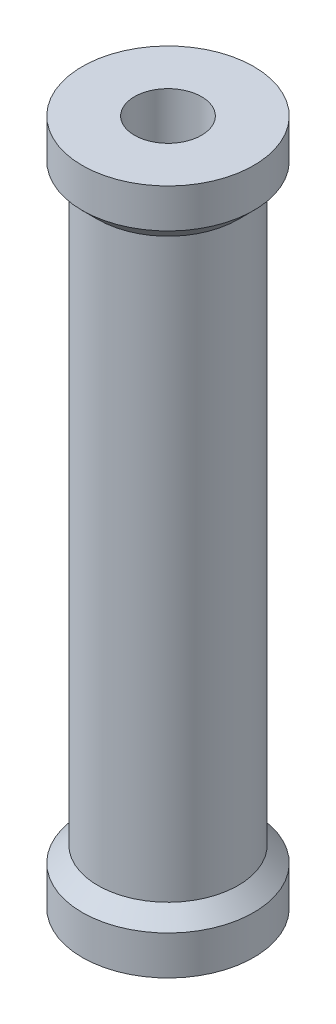
ISO-10303-21;
HEADER;
FILE_DESCRIPTION(('STEP AP214'),'2;1');
FILE_NAME('part.step','',(''),(''),'','','');
FILE_SCHEMA(('AUTOMOTIVE_DESIGN { 1 0 10303 214 1 1 1 1 }'));
ENDSEC;
DATA;
#1=APPLICATION_CONTEXT('core data for automotive mechanical design processes');
#2=APPLICATION_PROTOCOL_DEFINITION('international standard','automotive_design',2000,#1);
#3=PRODUCT_CONTEXT('',#1,'mechanical');
#4=PRODUCT('Part','Part','',(#3));
#5=PRODUCT_RELATED_PRODUCT_CATEGORY('part','',(#4));
#6=PRODUCT_DEFINITION_FORMATION('','',#4);
#7=PRODUCT_DEFINITION_CONTEXT('part definition',#1,'design');
#8=PRODUCT_DEFINITION('design','',#6,#7);
#9=PRODUCT_DEFINITION_SHAPE('','',#8);
#10=(LENGTH_UNIT() NAMED_UNIT(*) SI_UNIT(.MILLI.,.METRE.));
#11=(NAMED_UNIT(*) PLANE_ANGLE_UNIT() SI_UNIT($,.RADIAN.));
#12=(NAMED_UNIT(*) SI_UNIT($,.STERADIAN.) SOLID_ANGLE_UNIT());
#13=UNCERTAINTY_MEASURE_WITH_UNIT(LENGTH_MEASURE(1.E-05),#10,'distance_accuracy_value','');
#14=(GEOMETRIC_REPRESENTATION_CONTEXT(3) GLOBAL_UNCERTAINTY_ASSIGNED_CONTEXT((#13)) GLOBAL_UNIT_ASSIGNED_CONTEXT((#10,
#11,#12)) REPRESENTATION_CONTEXT('',''));
#15=CARTESIAN_POINT('',(0.,0.,0.));
#16=DIRECTION('',(0.,0.,1.));
#17=DIRECTION('',(1.,0.,0.));
#18=AXIS2_PLACEMENT_3D('',#15,#16,#17);
#19=CARTESIAN_POINT('',(0.,22.,0.));
#20=DIRECTION('',(0.,-1.,0.));
#21=DIRECTION('',(0.,0.,-1.));
#22=AXIS2_PLACEMENT_3D('',#19,#20,#21);
#23=CYLINDRICAL_SURFACE('',#22,4.5);
#24=CARTESIAN_POINT('',(0.,-18.5,0.));
#25=DIRECTION('',(0.,-1.,0.));
#26=DIRECTION('',(0.,0.,-1.));
#27=AXIS2_PLACEMENT_3D('',#24,#25,#26);
#28=CIRCLE('',#27,4.5);
#29=CARTESIAN_POINT('',(0.,-18.5,-4.5));
#30=VERTEX_POINT('',#29);
#31=EDGE_CURVE('E55',#30,#30,#28,.F.);
#32=ORIENTED_EDGE('',*,*,#31,.T.);
#33=EDGE_LOOP('',(#32));
#34=FACE_BOUND('',#33,.T.);
#35=CARTESIAN_POINT('',(0.,18.5,0.));
#36=DIRECTION('',(0.,1.,0.));
#37=DIRECTION('',(0.,0.,1.));
#38=AXIS2_PLACEMENT_3D('',#35,#36,#37);
#39=CIRCLE('',#38,4.5);
#40=CARTESIAN_POINT('',(0.,18.5,4.5));
#41=VERTEX_POINT('',#40);
#42=EDGE_CURVE('E59',#41,#41,#39,.F.);
#43=ORIENTED_EDGE('',*,*,#42,.T.);
#44=EDGE_LOOP('',(#43));
#45=FACE_BOUND('',#44,.T.);
#46=ADVANCED_FACE('F43',(#34,#45),#23,.T.);
#47=CARTESIAN_POINT('',(0.,22.,0.));
#48=DIRECTION('',(0.,1.,0.));
#49=DIRECTION('',(0.,0.,1.));
#50=AXIS2_PLACEMENT_3D('',#47,#48,#49);
#51=PLANE('',#50);
#52=CARTESIAN_POINT('',(0.,22.,0.));
#53=DIRECTION('',(0.,1.,0.));
#54=DIRECTION('',(0.,0.,1.));
#55=AXIS2_PLACEMENT_3D('',#52,#53,#54);
#56=CIRCLE('',#55,2.15);
#57=CARTESIAN_POINT('',(0.,22.,2.15));
#58=VERTEX_POINT('',#57);
#59=EDGE_CURVE('E64',#58,#58,#56,.T.);
#60=ORIENTED_EDGE('',*,*,#59,.F.);
#61=EDGE_LOOP('',(#60));
#62=FACE_BOUND('',#61,.T.);
#63=CARTESIAN_POINT('',(0.,22.,0.));
#64=DIRECTION('',(0.,1.,0.));
#65=DIRECTION('',(0.,0.,1.));
#66=AXIS2_PLACEMENT_3D('',#63,#64,#65);
#67=CIRCLE('',#66,5.5);
#68=CARTESIAN_POINT('',(0.,22.,5.5));
#69=VERTEX_POINT('',#68);
#70=EDGE_CURVE('E68',#69,#69,#67,.T.);
#71=ORIENTED_EDGE('',*,*,#70,.T.);
#72=EDGE_LOOP('',(#71));
#73=FACE_BOUND('',#72,.T.);
#74=ADVANCED_FACE('F82',(#62,#73),#51,.T.);
#75=CARTESIAN_POINT('',(0.,-22.,0.));
#76=DIRECTION('',(0.,1.,0.));
#77=DIRECTION('',(0.,0.,1.));
#78=AXIS2_PLACEMENT_3D('',#75,#76,#77);
#79=PLANE('',#78);
#80=CARTESIAN_POINT('',(0.,-22.,0.));
#81=DIRECTION('',(0.,1.,0.));
#82=DIRECTION('',(0.,0.,1.));
#83=AXIS2_PLACEMENT_3D('',#80,#81,#82);
#84=CIRCLE('',#83,2.15);
#85=CARTESIAN_POINT('',(0.,-22.,2.15));
#86=VERTEX_POINT('',#85);
#87=EDGE_CURVE('E65',#86,#86,#84,.T.);
#88=ORIENTED_EDGE('',*,*,#87,.T.);
#89=EDGE_LOOP('',(#88));
#90=FACE_BOUND('',#89,.T.);
#91=CARTESIAN_POINT('',(0.,-22.,0.));
#92=DIRECTION('',(0.,1.,0.));
#93=DIRECTION('',(0.,0.,1.));
#94=AXIS2_PLACEMENT_3D('',#91,#92,#93);
#95=CIRCLE('',#94,5.5);
#96=CARTESIAN_POINT('',(0.,-22.,5.5));
#97=VERTEX_POINT('',#96);
#98=EDGE_CURVE('E73',#97,#97,#95,.T.);
#99=ORIENTED_EDGE('',*,*,#98,.F.);
#100=EDGE_LOOP('',(#99));
#101=FACE_BOUND('',#100,.T.);
#102=ADVANCED_FACE('F79',(#90,#101),#79,.F.);
#103=CARTESIAN_POINT('',(0.,22.,0.));
#104=DIRECTION('',(0.,-1.,0.));
#105=DIRECTION('',(0.,0.,-1.));
#106=AXIS2_PLACEMENT_3D('',#103,#104,#105);
#107=CYLINDRICAL_SURFACE('',#106,2.15);
#108=ORIENTED_EDGE('',*,*,#87,.F.);
#109=EDGE_LOOP('',(#108));
#110=FACE_BOUND('',#109,.T.);
#111=ORIENTED_EDGE('',*,*,#59,.T.);
#112=EDGE_LOOP('',(#111));
#113=FACE_BOUND('',#112,.T.);
#114=ADVANCED_FACE('F81',(#110,#113),#107,.F.);
#115=CARTESIAN_POINT('',(0.,20.,0.));
#116=DIRECTION('',(0.,1.,0.));
#117=DIRECTION('',(0.,0.,1.));
#118=AXIS2_PLACEMENT_3D('',#115,#116,#117);
#119=CYLINDRICAL_SURFACE('',#118,5.5);
#120=CARTESIAN_POINT('',(0.,19.5,0.));
#121=DIRECTION('',(0.,1.,0.));
#122=DIRECTION('',(0.,0.,1.));
#123=AXIS2_PLACEMENT_3D('',#120,#121,#122);
#124=CIRCLE('',#123,5.5);
#125=CARTESIAN_POINT('',(0.,19.5,5.5));
#126=VERTEX_POINT('',#125);
#127=EDGE_CURVE('E10',#126,#126,#124,.T.);
#128=ORIENTED_EDGE('',*,*,#127,.T.);
#129=EDGE_LOOP('',(#128));
#130=FACE_BOUND('',#129,.T.);
#131=ORIENTED_EDGE('',*,*,#70,.F.);
#132=EDGE_LOOP('',(#131));
#133=FACE_BOUND('',#132,.T.);
#134=ADVANCED_FACE('F89',(#130,#133),#119,.T.);
#135=CARTESIAN_POINT('',(0.,-20.,0.));
#136=DIRECTION('',(0.,-1.,0.));
#137=DIRECTION('',(0.,0.,-1.));
#138=AXIS2_PLACEMENT_3D('',#135,#136,#137);
#139=CYLINDRICAL_SURFACE('',#138,5.5);
#140=CARTESIAN_POINT('',(0.,-19.5,0.));
#141=DIRECTION('',(0.,-1.,0.));
#142=DIRECTION('',(0.,0.,-1.));
#143=AXIS2_PLACEMENT_3D('',#140,#141,#142);
#144=CIRCLE('',#143,5.5);
#145=CARTESIAN_POINT('',(0.,-19.5,-5.5));
#146=VERTEX_POINT('',#145);
#147=EDGE_CURVE('E51',#146,#146,#144,.T.);
#148=ORIENTED_EDGE('',*,*,#147,.T.);
#149=EDGE_LOOP('',(#148));
#150=FACE_BOUND('',#149,.T.);
#151=ORIENTED_EDGE('',*,*,#98,.T.);
#152=EDGE_LOOP('',(#151));
#153=FACE_BOUND('',#152,.T.);
#154=ADVANCED_FACE('F77',(#150,#153),#139,.T.);
#155=CARTESIAN_POINT('',(0.,-20.,0.));
#156=DIRECTION('',(0.,-1.,0.));
#157=DIRECTION('',(0.,0.,-1.));
#158=AXIS2_PLACEMENT_3D('',#155,#156,#157);
#159=CONICAL_SURFACE('',#158,6.00000000000003,0.785398163397452);
#160=ORIENTED_EDGE('',*,*,#31,.F.);
#161=EDGE_LOOP('',(#160));
#162=FACE_BOUND('',#161,.T.);
#163=ORIENTED_EDGE('',*,*,#147,.F.);
#164=EDGE_LOOP('',(#163));
#165=FACE_BOUND('',#164,.T.);
#166=ADVANCED_FACE('F102',(#162,#165),#159,.T.);
#167=CARTESIAN_POINT('',(0.,20.,0.));
#168=DIRECTION('',(0.,1.,0.));
#169=DIRECTION('',(0.,0.,1.));
#170=AXIS2_PLACEMENT_3D('',#167,#168,#169);
#171=CONICAL_SURFACE('',#170,6.00000000000003,0.785398163397453);
#172=CARTESIAN_POINT('',(0.,18.5,4.5));
#173=CARTESIAN_POINT('',(0.,18.5104166666667,4.51041666666667));
#174=CARTESIAN_POINT('',(0.,18.5208333333333,4.52083333333333));
#175=CARTESIAN_POINT('',(0.,18.5416666666666,4.54166666666667));
#176=CARTESIAN_POINT('',(0.,18.5520833333333,4.55208333333333));
#177=CARTESIAN_POINT('',(0.,18.5729166666666,4.57291666666666));
#178=CARTESIAN_POINT('',(0.,18.5833333333333,4.58333333333333));
#179=CARTESIAN_POINT('',(0.,18.6041666666666,4.60416666666666));
#180=CARTESIAN_POINT('',(0.,18.6145833333333,4.61458333333333));
#181=CARTESIAN_POINT('',(0.,18.6354166666666,4.63541666666666));
#182=CARTESIAN_POINT('',(0.,18.6458333333333,4.64583333333333));
#183=CARTESIAN_POINT('',(0.,18.6666666666666,4.66666666666666));
#184=CARTESIAN_POINT('',(0.,18.6770833333333,4.67708333333333));
#185=CARTESIAN_POINT('',(0.,18.6979166666666,4.69791666666666));
#186=CARTESIAN_POINT('',(0.,18.7083333333333,4.70833333333333));
#187=CARTESIAN_POINT('',(0.,18.7291666666666,4.72916666666666));
#188=CARTESIAN_POINT('',(0.,18.7395833333333,4.73958333333333));
#189=CARTESIAN_POINT('',(0.,18.7604166666666,4.76041666666666));
#190=CARTESIAN_POINT('',(0.,18.7708333333333,4.77083333333333));
#191=CARTESIAN_POINT('',(0.,18.7916666666666,4.79166666666666));
#192=CARTESIAN_POINT('',(0.,18.8020833333333,4.80208333333333));
#193=CARTESIAN_POINT('',(0.,18.8229166666666,4.82291666666666));
#194=CARTESIAN_POINT('',(0.,18.8333333333333,4.83333333333333));
#195=CARTESIAN_POINT('',(0.,18.8541666666666,4.85416666666667));
#196=CARTESIAN_POINT('',(0.,18.8645833333333,4.86458333333333));
#197=CARTESIAN_POINT('',(0.,18.8854166666666,4.88541666666666));
#198=CARTESIAN_POINT('',(0.,18.8958333333333,4.89583333333333));
#199=CARTESIAN_POINT('',(0.,18.9166666666666,4.91666666666666));
#200=CARTESIAN_POINT('',(0.,18.9270833333333,4.92708333333333));
#201=CARTESIAN_POINT('',(0.,18.9479166666666,4.94791666666666));
#202=CARTESIAN_POINT('',(0.,18.9583333333333,4.95833333333333));
#203=CARTESIAN_POINT('',(0.,18.9791666666666,4.97916666666666));
#204=CARTESIAN_POINT('',(0.,18.9895833333333,4.98958333333333));
#205=CARTESIAN_POINT('',(0.,19.0104166666666,5.01041666666667));
#206=CARTESIAN_POINT('',(0.,19.0208333333333,5.02083333333333));
#207=CARTESIAN_POINT('',(0.,19.0416666666666,5.04166666666667));
#208=CARTESIAN_POINT('',(0.,19.0520833333333,5.05208333333333));
#209=CARTESIAN_POINT('',(0.,19.0729166666666,5.07291666666667));
#210=CARTESIAN_POINT('',(0.,19.0833333333333,5.08333333333333));
#211=CARTESIAN_POINT('',(0.,19.1041666666666,5.10416666666666));
#212=CARTESIAN_POINT('',(0.,19.1145833333333,5.11458333333333));
#213=CARTESIAN_POINT('',(0.,19.1354166666666,5.13541666666666));
#214=CARTESIAN_POINT('',(0.,19.1458333333333,5.14583333333333));
#215=CARTESIAN_POINT('',(0.,19.1666666666666,5.16666666666666));
#216=CARTESIAN_POINT('',(0.,19.1770833333333,5.17708333333333));
#217=CARTESIAN_POINT('',(0.,19.1979166666666,5.19791666666667));
#218=CARTESIAN_POINT('',(0.,19.2083333333333,5.20833333333333));
#219=CARTESIAN_POINT('',(0.,19.2291666666666,5.22916666666666));
#220=CARTESIAN_POINT('',(0.,19.2395833333333,5.23958333333333));
#221=CARTESIAN_POINT('',(0.,19.2604166666666,5.26041666666666));
#222=CARTESIAN_POINT('',(0.,19.2708333333333,5.27083333333333));
#223=CARTESIAN_POINT('',(0.,19.2916666666666,5.29166666666666));
#224=CARTESIAN_POINT('',(0.,19.3020833333333,5.30208333333333));
#225=CARTESIAN_POINT('',(0.,19.3229166666666,5.32291666666666));
#226=CARTESIAN_POINT('',(0.,19.3333333333333,5.33333333333333));
#227=CARTESIAN_POINT('',(0.,19.3541666666666,5.35416666666666));
#228=CARTESIAN_POINT('',(0.,19.3645833333333,5.36458333333333));
#229=CARTESIAN_POINT('',(0.,19.3854166666666,5.38541666666666));
#230=CARTESIAN_POINT('',(0.,19.3958333333333,5.39583333333333));
#231=CARTESIAN_POINT('',(0.,19.4166666666666,5.41666666666666));
#232=CARTESIAN_POINT('',(0.,19.4270833333333,5.42708333333333));
#233=CARTESIAN_POINT('',(0.,19.4479166666666,5.44791666666666));
#234=CARTESIAN_POINT('',(0.,19.4583333333333,5.45833333333333));
#235=CARTESIAN_POINT('',(0.,19.4791666666666,5.47916666666666));
#236=CARTESIAN_POINT('',(0.,19.4895833333333,5.48958333333333));
#237=CARTESIAN_POINT('',(0.,19.5,5.5));
#238=B_SPLINE_CURVE_WITH_KNOTS('',3,(#172,#173,#174,#175,#176,#177,#178,#179,#180,#181,#182,
#183,#184,#185,#186,#187,#188,#189,#190,#191,#192,#193,#194,#195,#196,#197,#198,#199,#200,#201,
#202,#203,#204,#205,#206,#207,#208,#209,#210,#211,#212,#213,#214,#215,#216,#217,#218,#219,#220,
#221,#222,#223,#224,#225,#226,#227,#228,#229,#230,#231,#232,#233,#234,#235,#236,#237),
.UNSPECIFIED.,.F.,.F.,(4,2,2,2,2,2,2,2,2,2,2,2,2,2,2,2,2,2,2,2,2,2,2,2,2,2,2,2,2,2,2,2,4),(0.,
0.0441941738241568,0.0883883476483161,0.132582521472475,0.176776695296635,0.220970869120794,
0.265165042944953,0.309359216769112,0.353553390593272,0.397747564417431,0.44194173824159,
0.486135912065747,0.530330085889906,0.574524259714066,0.618718433538224,0.662912607362384,
0.707106781186543,0.751300955010703,0.795495128834862,0.83968930265902,0.88388347648318,
0.928077650307339,0.972271824131496,1.01646599795565,1.06066017177981,1.10485434560397,
1.14904851942813,1.19324269325229,1.23743686707645,1.28163104090061,1.32582521472477,
1.37001938854893,1.41421356237309),.UNSPECIFIED.);
#239=EDGE_CURVE('BSEAM46',#41,#126,#238,.T.);
#240=ORIENTED_EDGE('',*,*,#42,.F.);
#241=ORIENTED_EDGE('',*,*,#127,.F.);
#242=ORIENTED_EDGE('',*,*,#239,.T.);
#243=ORIENTED_EDGE('',*,*,#239,.F.);
#244=EDGE_LOOP('',(#240,#242,#241,#243));
#245=FACE_BOUND('',#244,.T.);
#246=ADVANCED_FACE('F46',(#245),#171,.T.);
#247=CLOSED_SHELL('',(#46,#74,#102,#114,#134,#154,#166,#246));
#248=MANIFOLD_SOLID_BREP('B2',#247);
#249=ADVANCED_BREP_SHAPE_REPRESENTATION('',(#18,#248),#14);
#250=SHAPE_DEFINITION_REPRESENTATION(#9,#249);
ENDSEC;
END-ISO-10303-21;
